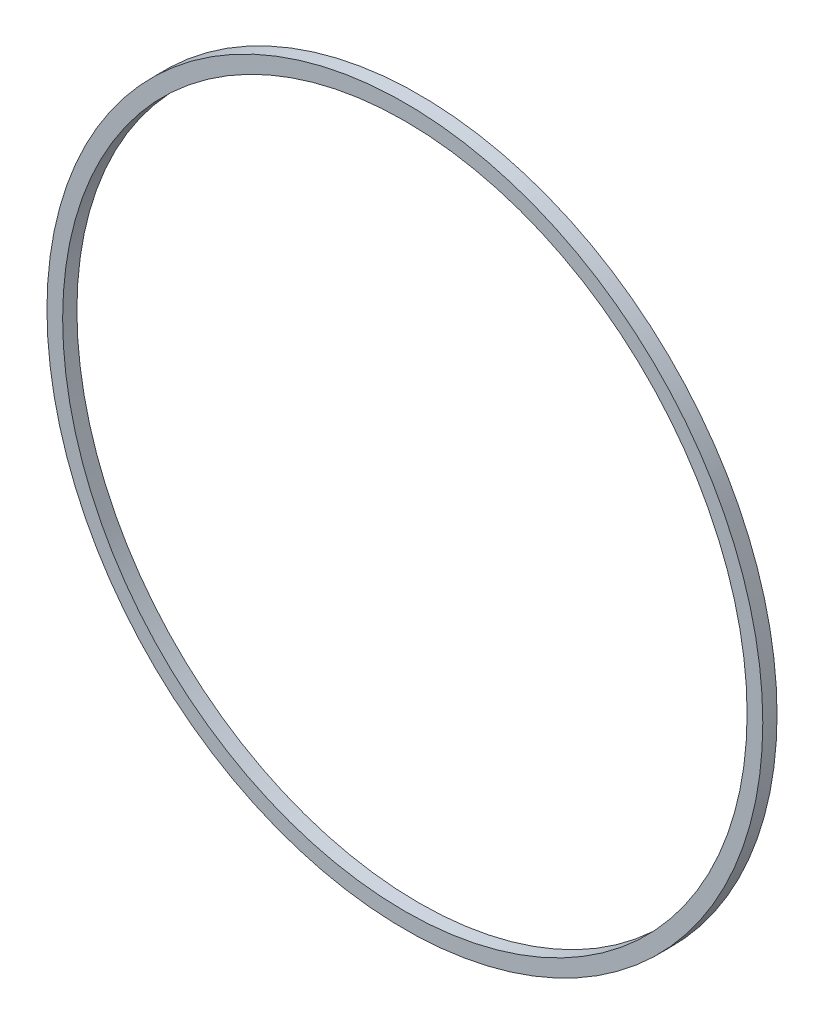
ISO-10303-21;
HEADER;
FILE_DESCRIPTION(('STEP AP214'),'2;1');
FILE_NAME('part.step','',(''),(''),'','','');
FILE_SCHEMA(('AUTOMOTIVE_DESIGN { 1 0 10303 214 1 1 1 1 }'));
ENDSEC;
DATA;
#1=APPLICATION_CONTEXT('core data for automotive mechanical design processes');
#2=APPLICATION_PROTOCOL_DEFINITION('international standard','automotive_design',2000,#1);
#3=PRODUCT_CONTEXT('',#1,'mechanical');
#4=PRODUCT('Part','Part','',(#3));
#5=PRODUCT_RELATED_PRODUCT_CATEGORY('part','',(#4));
#6=PRODUCT_DEFINITION_FORMATION('','',#4);
#7=PRODUCT_DEFINITION_CONTEXT('part definition',#1,'design');
#8=PRODUCT_DEFINITION('design','',#6,#7);
#9=PRODUCT_DEFINITION_SHAPE('','',#8);
#10=(LENGTH_UNIT() NAMED_UNIT(*) SI_UNIT(.MILLI.,.METRE.));
#11=(NAMED_UNIT(*) PLANE_ANGLE_UNIT() SI_UNIT($,.RADIAN.));
#12=(NAMED_UNIT(*) SI_UNIT($,.STERADIAN.) SOLID_ANGLE_UNIT());
#13=UNCERTAINTY_MEASURE_WITH_UNIT(LENGTH_MEASURE(1.E-05),#10,'distance_accuracy_value','');
#14=(GEOMETRIC_REPRESENTATION_CONTEXT(3) GLOBAL_UNCERTAINTY_ASSIGNED_CONTEXT((#13)) GLOBAL_UNIT_ASSIGNED_CONTEXT((#10,
#11,#12)) REPRESENTATION_CONTEXT('',''));
#15=CARTESIAN_POINT('',(0.,0.,0.));
#16=DIRECTION('',(0.,0.,1.));
#17=DIRECTION('',(1.,0.,0.));
#18=AXIS2_PLACEMENT_3D('',#15,#16,#17);
#19=CARTESIAN_POINT('',(-75.,-75.,11.));
#20=DIRECTION('',(0.,0.,1.));
#21=DIRECTION('',(1.,0.,0.));
#22=AXIS2_PLACEMENT_3D('',#19,#20,#21);
#23=PLANE('',#22);
#24=CARTESIAN_POINT('',(0.,0.,11.));
#25=DIRECTION('',(0.,0.,1.));
#26=DIRECTION('',(1.,0.,0.));
#27=AXIS2_PLACEMENT_3D('',#24,#25,#26);
#28=CIRCLE('',#27,48.);
#29=CARTESIAN_POINT('',(48.,0.,11.));
#30=VERTEX_POINT('',#29);
#31=EDGE_CURVE('E27',#30,#30,#28,.F.);
#32=ORIENTED_EDGE('',*,*,#31,.T.);
#33=EDGE_LOOP('',(#32));
#34=FACE_BOUND('',#33,.T.);
#35=CARTESIAN_POINT('',(0.,0.,11.));
#36=DIRECTION('',(0.,0.,1.));
#37=DIRECTION('',(1.,0.,0.));
#38=AXIS2_PLACEMENT_3D('',#35,#36,#37);
#39=CIRCLE('',#38,50.2);
#40=CARTESIAN_POINT('',(50.2,0.,11.));
#41=VERTEX_POINT('',#40);
#42=EDGE_CURVE('E18',#41,#41,#39,.F.);
#43=ORIENTED_EDGE('',*,*,#42,.F.);
#44=EDGE_LOOP('',(#43));
#45=FACE_BOUND('',#44,.T.);
#46=ADVANCED_FACE('F15',(#34,#45),#23,.T.);
#47=CARTESIAN_POINT('',(0.,0.,0.));
#48=DIRECTION('',(0.,0.,1.));
#49=DIRECTION('',(1.,0.,0.));
#50=AXIS2_PLACEMENT_3D('',#47,#48,#49);
#51=CYLINDRICAL_SURFACE('',#50,50.2);
#52=ORIENTED_EDGE('',*,*,#42,.T.);
#53=EDGE_LOOP('',(#52));
#54=FACE_BOUND('',#53,.T.);
#55=CARTESIAN_POINT('',(0.,0.,9.));
#56=DIRECTION('',(0.,0.,1.));
#57=DIRECTION('',(1.,0.,0.));
#58=AXIS2_PLACEMENT_3D('',#55,#56,#57);
#59=CIRCLE('',#58,50.2);
#60=CARTESIAN_POINT('',(50.2,0.,9.));
#61=VERTEX_POINT('',#60);
#62=EDGE_CURVE('E22',#61,#61,#59,.T.);
#63=ORIENTED_EDGE('',*,*,#62,.T.);
#64=EDGE_LOOP('',(#63));
#65=FACE_BOUND('',#64,.T.);
#66=ADVANCED_FACE('F35',(#54,#65),#51,.T.);
#67=CARTESIAN_POINT('',(0.,0.,0.));
#68=DIRECTION('',(0.,0.,1.));
#69=DIRECTION('',(1.,0.,0.));
#70=AXIS2_PLACEMENT_3D('',#67,#68,#69);
#71=CYLINDRICAL_SURFACE('',#70,48.);
#72=ORIENTED_EDGE('',*,*,#31,.F.);
#73=EDGE_LOOP('',(#72));
#74=FACE_BOUND('',#73,.T.);
#75=CARTESIAN_POINT('',(0.,0.,9.));
#76=DIRECTION('',(0.,0.,1.));
#77=DIRECTION('',(1.,0.,0.));
#78=AXIS2_PLACEMENT_3D('',#75,#76,#77);
#79=CIRCLE('',#78,48.);
#80=CARTESIAN_POINT('',(48.,0.,9.));
#81=VERTEX_POINT('',#80);
#82=EDGE_CURVE('E10',#81,#81,#79,.F.);
#83=ORIENTED_EDGE('',*,*,#82,.T.);
#84=EDGE_LOOP('',(#83));
#85=FACE_BOUND('',#84,.T.);
#86=ADVANCED_FACE('F43',(#74,#85),#71,.F.);
#87=CARTESIAN_POINT('',(-75.,-75.,9.));
#88=DIRECTION('',(0.,0.,1.));
#89=DIRECTION('',(1.,0.,0.));
#90=AXIS2_PLACEMENT_3D('',#87,#88,#89);
#91=PLANE('',#90);
#92=ORIENTED_EDGE('',*,*,#82,.F.);
#93=EDGE_LOOP('',(#92));
#94=FACE_BOUND('',#93,.T.);
#95=ORIENTED_EDGE('',*,*,#62,.F.);
#96=EDGE_LOOP('',(#95));
#97=FACE_BOUND('',#96,.T.);
#98=ADVANCED_FACE('F44',(#94,#97),#91,.F.);
#99=CLOSED_SHELL('',(#46,#66,#86,#98));
#100=MANIFOLD_SOLID_BREP('B1',#99);
#101=ADVANCED_BREP_SHAPE_REPRESENTATION('',(#18,#100),#14);
#102=SHAPE_DEFINITION_REPRESENTATION(#9,#101);
ENDSEC;
END-ISO-10303-21;
